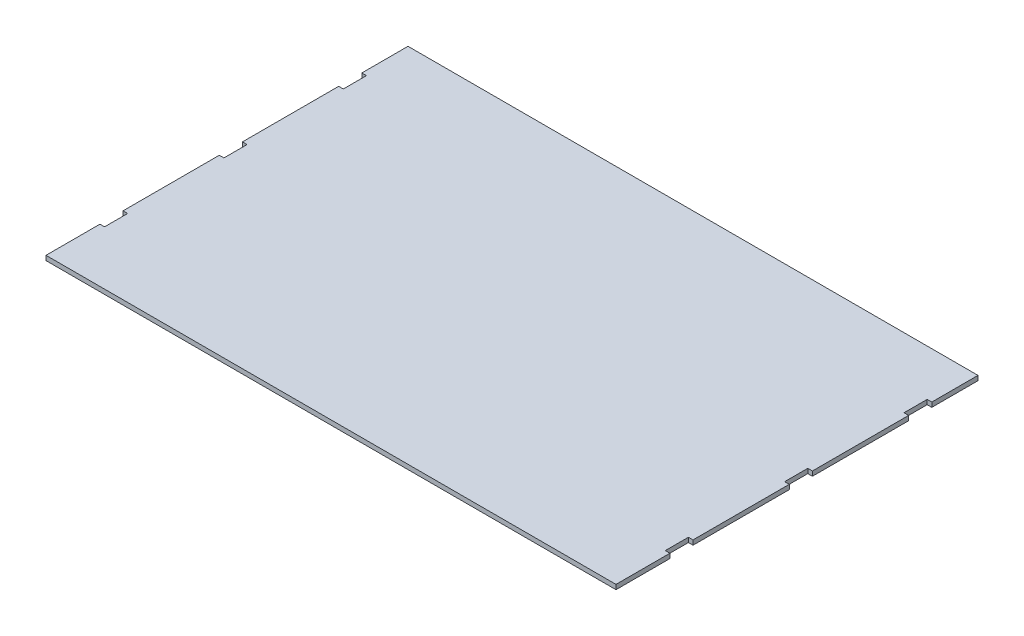
ISO-10303-21;
HEADER;
FILE_DESCRIPTION(('STEP AP214'),'2;1');
FILE_NAME('part.step','',(''),(''),'','','');
FILE_SCHEMA(('AUTOMOTIVE_DESIGN { 1 0 10303 214 1 1 1 1 }'));
ENDSEC;
DATA;
#1=APPLICATION_CONTEXT('core data for automotive mechanical design processes');
#2=APPLICATION_PROTOCOL_DEFINITION('international standard','automotive_design',2000,#1);
#3=PRODUCT_CONTEXT('',#1,'mechanical');
#4=PRODUCT('Part','Part','',(#3));
#5=PRODUCT_RELATED_PRODUCT_CATEGORY('part','',(#4));
#6=PRODUCT_DEFINITION_FORMATION('','',#4);
#7=PRODUCT_DEFINITION_CONTEXT('part definition',#1,'design');
#8=PRODUCT_DEFINITION('design','',#6,#7);
#9=PRODUCT_DEFINITION_SHAPE('','',#8);
#10=(LENGTH_UNIT() NAMED_UNIT(*) SI_UNIT(.MILLI.,.METRE.));
#11=(NAMED_UNIT(*) PLANE_ANGLE_UNIT() SI_UNIT($,.RADIAN.));
#12=(NAMED_UNIT(*) SI_UNIT($,.STERADIAN.) SOLID_ANGLE_UNIT());
#13=UNCERTAINTY_MEASURE_WITH_UNIT(LENGTH_MEASURE(1.E-05),#10,'distance_accuracy_value','');
#14=(GEOMETRIC_REPRESENTATION_CONTEXT(3) GLOBAL_UNCERTAINTY_ASSIGNED_CONTEXT((#13)) GLOBAL_UNIT_ASSIGNED_CONTEXT((#10,
#11,#12)) REPRESENTATION_CONTEXT('',''));
#15=CARTESIAN_POINT('',(0.,0.,0.));
#16=DIRECTION('',(0.,0.,1.));
#17=DIRECTION('',(1.,0.,0.));
#18=AXIS2_PLACEMENT_3D('',#15,#16,#17);
#19=CARTESIAN_POINT('',(0.,3.,0.));
#20=DIRECTION('',(1.,0.,0.));
#21=DIRECTION('',(0.,0.,-1.));
#22=AXIS2_PLACEMENT_3D('',#19,#20,#21);
#23=PLANE('',#22);
#24=DIRECTION('',(0.,0.,1.));
#25=VECTOR('',#24,1.);
#26=CARTESIAN_POINT('',(0.,0.,0.));
#27=LINE('',#26,#25);
#28=CARTESIAN_POINT('',(0.,0.,-35.0000000000001));
#29=VERTEX_POINT('',#28);
#30=CARTESIAN_POINT('',(0.,0.,0.));
#31=VERTEX_POINT('',#30);
#32=EDGE_CURVE('E250',#29,#31,#27,.T.);
#33=ORIENTED_EDGE('',*,*,#32,.T.);
#34=DIRECTION('',(0.,-1.,0.));
#35=VECTOR('',#34,1.);
#36=CARTESIAN_POINT('',(0.,3.,0.));
#37=LINE('',#36,#35);
#38=CARTESIAN_POINT('',(0.,3.,0.));
#39=VERTEX_POINT('',#38);
#40=EDGE_CURVE('E11',#39,#31,#37,.T.);
#41=ORIENTED_EDGE('',*,*,#40,.F.);
#42=DIRECTION('',(0.,0.,1.));
#43=VECTOR('',#42,1.);
#44=CARTESIAN_POINT('',(0.,3.,0.));
#45=LINE('',#44,#43);
#46=CARTESIAN_POINT('',(0.,3.,-35.0000000000001));
#47=VERTEX_POINT('',#46);
#48=EDGE_CURVE('E304',#47,#39,#45,.T.);
#49=ORIENTED_EDGE('',*,*,#48,.F.);
#50=DIRECTION('',(0.,-1.,0.));
#51=VECTOR('',#50,1.);
#52=CARTESIAN_POINT('',(0.,3.,-35.0000000000001));
#53=LINE('',#52,#51);
#54=EDGE_CURVE('E246',#47,#29,#53,.T.);
#55=ORIENTED_EDGE('',*,*,#54,.T.);
#56=EDGE_LOOP('',(#33,#41,#49,#55));
#57=FACE_BOUND('',#56,.T.);
#58=ADVANCED_FACE('F34',(#57),#23,.F.);
#59=CARTESIAN_POINT('',(0.,3.,0.));
#60=DIRECTION('',(0.,0.,-1.));
#61=DIRECTION('',(-1.,0.,0.));
#62=AXIS2_PLACEMENT_3D('',#59,#60,#61);
#63=PLANE('',#62);
#64=DIRECTION('',(1.,0.,0.));
#65=VECTOR('',#64,1.);
#66=CARTESIAN_POINT('',(0.,0.,0.));
#67=LINE('',#66,#65);
#68=CARTESIAN_POINT('',(370.,0.,0.));
#69=VERTEX_POINT('',#68);
#70=EDGE_CURVE('E253',#31,#69,#67,.T.);
#71=ORIENTED_EDGE('',*,*,#70,.T.);
#72=DIRECTION('',(0.,-1.,0.));
#73=VECTOR('',#72,1.);
#74=CARTESIAN_POINT('',(370.,3.,0.));
#75=LINE('',#74,#73);
#76=CARTESIAN_POINT('',(370.,3.,0.));
#77=VERTEX_POINT('',#76);
#78=EDGE_CURVE('E42',#77,#69,#75,.T.);
#79=ORIENTED_EDGE('',*,*,#78,.F.);
#80=DIRECTION('',(1.,0.,0.));
#81=VECTOR('',#80,1.);
#82=CARTESIAN_POINT('',(0.,3.,0.));
#83=LINE('',#82,#81);
#84=EDGE_CURVE('E153',#39,#77,#83,.T.);
#85=ORIENTED_EDGE('',*,*,#84,.F.);
#86=ORIENTED_EDGE('',*,*,#40,.T.);
#87=EDGE_LOOP('',(#71,#79,#85,#86));
#88=FACE_BOUND('',#87,.T.);
#89=ADVANCED_FACE('F462',(#88),#63,.F.);
#90=CARTESIAN_POINT('',(370.,3.,-35.));
#91=DIRECTION('',(-1.,0.,0.));
#92=DIRECTION('',(0.,0.,1.));
#93=AXIS2_PLACEMENT_3D('',#90,#91,#92);
#94=PLANE('',#93);
#95=DIRECTION('',(0.,0.,-1.));
#96=VECTOR('',#95,1.);
#97=CARTESIAN_POINT('',(370.,0.,-35.));
#98=LINE('',#97,#96);
#99=CARTESIAN_POINT('',(370.,0.,-35.));
#100=VERTEX_POINT('',#99);
#101=EDGE_CURVE('E255',#69,#100,#98,.T.);
#102=ORIENTED_EDGE('',*,*,#101,.T.);
#103=DIRECTION('',(0.,-1.,0.));
#104=VECTOR('',#103,1.);
#105=CARTESIAN_POINT('',(370.,3.,-35.));
#106=LINE('',#105,#104);
#107=CARTESIAN_POINT('',(370.,3.,-35.));
#108=VERTEX_POINT('',#107);
#109=EDGE_CURVE('E371',#108,#100,#106,.T.);
#110=ORIENTED_EDGE('',*,*,#109,.F.);
#111=DIRECTION('',(0.,0.,-1.));
#112=VECTOR('',#111,1.);
#113=CARTESIAN_POINT('',(370.,3.,-35.));
#114=LINE('',#113,#112);
#115=EDGE_CURVE('E379',#77,#108,#114,.T.);
#116=ORIENTED_EDGE('',*,*,#115,.F.);
#117=ORIENTED_EDGE('',*,*,#78,.T.);
#118=EDGE_LOOP('',(#102,#110,#116,#117));
#119=FACE_BOUND('',#118,.T.);
#120=ADVANCED_FACE('F377',(#119),#94,.F.);
#121=CARTESIAN_POINT('',(370.,3.,-35.));
#122=DIRECTION('',(0.,0.,1.));
#123=DIRECTION('',(1.,0.,0.));
#124=AXIS2_PLACEMENT_3D('',#121,#122,#123);
#125=PLANE('',#124);
#126=DIRECTION('',(-1.,0.,0.));
#127=VECTOR('',#126,1.);
#128=CARTESIAN_POINT('',(370.,0.,-35.));
#129=LINE('',#128,#127);
#130=CARTESIAN_POINT('',(367.,0.,-35.));
#131=VERTEX_POINT('',#130);
#132=EDGE_CURVE('E257',#100,#131,#129,.T.);
#133=ORIENTED_EDGE('',*,*,#132,.T.);
#134=DIRECTION('',(0.,-1.,0.));
#135=VECTOR('',#134,1.);
#136=CARTESIAN_POINT('',(367.,3.,-35.));
#137=LINE('',#136,#135);
#138=CARTESIAN_POINT('',(367.,3.,-35.));
#139=VERTEX_POINT('',#138);
#140=EDGE_CURVE('E368',#139,#131,#137,.T.);
#141=ORIENTED_EDGE('',*,*,#140,.F.);
#142=DIRECTION('',(-1.,0.,0.));
#143=VECTOR('',#142,1.);
#144=CARTESIAN_POINT('',(370.,3.,-35.));
#145=LINE('',#144,#143);
#146=EDGE_CURVE('E397',#108,#139,#145,.T.);
#147=ORIENTED_EDGE('',*,*,#146,.F.);
#148=ORIENTED_EDGE('',*,*,#109,.T.);
#149=EDGE_LOOP('',(#133,#141,#147,#148));
#150=FACE_BOUND('',#149,.T.);
#151=ADVANCED_FACE('F388',(#150),#125,.F.);
#152=CARTESIAN_POINT('',(367.,3.,-35.));
#153=DIRECTION('',(-1.,0.,0.));
#154=DIRECTION('',(0.,0.,1.));
#155=AXIS2_PLACEMENT_3D('',#152,#153,#154);
#156=PLANE('',#155);
#157=DIRECTION('',(0.,0.,-1.));
#158=VECTOR('',#157,1.);
#159=CARTESIAN_POINT('',(367.,0.,-35.));
#160=LINE('',#159,#158);
#161=CARTESIAN_POINT('',(367.,0.,-49.9999999999999));
#162=VERTEX_POINT('',#161);
#163=EDGE_CURVE('E259',#131,#162,#160,.T.);
#164=ORIENTED_EDGE('',*,*,#163,.T.);
#165=DIRECTION('',(0.,-1.,0.));
#166=VECTOR('',#165,1.);
#167=CARTESIAN_POINT('',(367.,3.,-49.9999999999999));
#168=LINE('',#167,#166);
#169=CARTESIAN_POINT('',(367.,3.,-49.9999999999999));
#170=VERTEX_POINT('',#169);
#171=EDGE_CURVE('E365',#170,#162,#168,.T.);
#172=ORIENTED_EDGE('',*,*,#171,.F.);
#173=DIRECTION('',(0.,0.,-1.));
#174=VECTOR('',#173,1.);
#175=CARTESIAN_POINT('',(367.,3.,-35.));
#176=LINE('',#175,#174);
#177=EDGE_CURVE('E394',#139,#170,#176,.T.);
#178=ORIENTED_EDGE('',*,*,#177,.F.);
#179=ORIENTED_EDGE('',*,*,#140,.T.);
#180=EDGE_LOOP('',(#164,#172,#178,#179));
#181=FACE_BOUND('',#180,.T.);
#182=ADVANCED_FACE('F392',(#181),#156,.F.);
#183=CARTESIAN_POINT('',(367.,3.,-49.9999999999999));
#184=DIRECTION('',(0.,0.,-1.));
#185=DIRECTION('',(-1.,0.,0.));
#186=AXIS2_PLACEMENT_3D('',#183,#184,#185);
#187=PLANE('',#186);
#188=DIRECTION('',(1.,0.,0.));
#189=VECTOR('',#188,1.);
#190=CARTESIAN_POINT('',(367.,0.,-49.9999999999999));
#191=LINE('',#190,#189);
#192=CARTESIAN_POINT('',(370.,0.,-49.9999999999999));
#193=VERTEX_POINT('',#192);
#194=EDGE_CURVE('E261',#162,#193,#191,.T.);
#195=ORIENTED_EDGE('',*,*,#194,.T.);
#196=DIRECTION('',(0.,-1.,0.));
#197=VECTOR('',#196,1.);
#198=CARTESIAN_POINT('',(370.,3.,-49.9999999999999));
#199=LINE('',#198,#197);
#200=CARTESIAN_POINT('',(370.,3.,-49.9999999999999));
#201=VERTEX_POINT('',#200);
#202=EDGE_CURVE('E362',#201,#193,#199,.T.);
#203=ORIENTED_EDGE('',*,*,#202,.F.);
#204=DIRECTION('',(1.,0.,0.));
#205=VECTOR('',#204,1.);
#206=CARTESIAN_POINT('',(367.,3.,-49.9999999999999));
#207=LINE('',#206,#205);
#208=EDGE_CURVE('E396',#170,#201,#207,.T.);
#209=ORIENTED_EDGE('',*,*,#208,.F.);
#210=ORIENTED_EDGE('',*,*,#171,.T.);
#211=EDGE_LOOP('',(#195,#203,#209,#210));
#212=FACE_BOUND('',#211,.T.);
#213=ADVANCED_FACE('F475',(#212),#187,.F.);
#214=CARTESIAN_POINT('',(370.,3.,-112.5));
#215=DIRECTION('',(-1.,0.,0.));
#216=DIRECTION('',(0.,0.,1.));
#217=AXIS2_PLACEMENT_3D('',#214,#215,#216);
#218=PLANE('',#217);
#219=DIRECTION('',(0.,0.,-1.));
#220=VECTOR('',#219,1.);
#221=CARTESIAN_POINT('',(370.,0.,-112.5));
#222=LINE('',#221,#220);
#223=CARTESIAN_POINT('',(370.,0.,-112.5));
#224=VERTEX_POINT('',#223);
#225=EDGE_CURVE('E263',#193,#224,#222,.T.);
#226=ORIENTED_EDGE('',*,*,#225,.T.);
#227=DIRECTION('',(0.,-1.,0.));
#228=VECTOR('',#227,1.);
#229=CARTESIAN_POINT('',(370.,3.,-112.5));
#230=LINE('',#229,#228);
#231=CARTESIAN_POINT('',(370.,3.,-112.5));
#232=VERTEX_POINT('',#231);
#233=EDGE_CURVE('E359',#232,#224,#230,.T.);
#234=ORIENTED_EDGE('',*,*,#233,.F.);
#235=DIRECTION('',(0.,0.,-1.));
#236=VECTOR('',#235,1.);
#237=CARTESIAN_POINT('',(370.,3.,-112.5));
#238=LINE('',#237,#236);
#239=EDGE_CURVE('E399',#201,#232,#238,.T.);
#240=ORIENTED_EDGE('',*,*,#239,.F.);
#241=ORIENTED_EDGE('',*,*,#202,.T.);
#242=EDGE_LOOP('',(#226,#234,#240,#241));
#243=FACE_BOUND('',#242,.T.);
#244=ADVANCED_FACE('F478',(#243),#218,.F.);
#245=CARTESIAN_POINT('',(367.,3.,-112.5));
#246=DIRECTION('',(0.,0.,1.));
#247=DIRECTION('',(1.,0.,0.));
#248=AXIS2_PLACEMENT_3D('',#245,#246,#247);
#249=PLANE('',#248);
#250=DIRECTION('',(-1.,0.,0.));
#251=VECTOR('',#250,1.);
#252=CARTESIAN_POINT('',(367.,0.,-112.5));
#253=LINE('',#252,#251);
#254=CARTESIAN_POINT('',(367.,0.,-112.5));
#255=VERTEX_POINT('',#254);
#256=EDGE_CURVE('E265',#224,#255,#253,.T.);
#257=ORIENTED_EDGE('',*,*,#256,.T.);
#258=DIRECTION('',(0.,-1.,0.));
#259=VECTOR('',#258,1.);
#260=CARTESIAN_POINT('',(367.,3.,-112.5));
#261=LINE('',#260,#259);
#262=CARTESIAN_POINT('',(367.,3.,-112.5));
#263=VERTEX_POINT('',#262);
#264=EDGE_CURVE('E356',#263,#255,#261,.T.);
#265=ORIENTED_EDGE('',*,*,#264,.F.);
#266=DIRECTION('',(-1.,0.,0.));
#267=VECTOR('',#266,1.);
#268=CARTESIAN_POINT('',(367.,3.,-112.5));
#269=LINE('',#268,#267);
#270=EDGE_CURVE('E405',#232,#263,#269,.T.);
#271=ORIENTED_EDGE('',*,*,#270,.F.);
#272=ORIENTED_EDGE('',*,*,#233,.T.);
#273=EDGE_LOOP('',(#257,#265,#271,#272));
#274=FACE_BOUND('',#273,.T.);
#275=ADVANCED_FACE('F482',(#274),#249,.F.);
#276=CARTESIAN_POINT('',(367.,3.,-127.5));
#277=DIRECTION('',(-1.,0.,0.));
#278=DIRECTION('',(0.,0.,1.));
#279=AXIS2_PLACEMENT_3D('',#276,#277,#278);
#280=PLANE('',#279);
#281=DIRECTION('',(0.,0.,-1.));
#282=VECTOR('',#281,1.);
#283=CARTESIAN_POINT('',(367.,0.,-127.5));
#284=LINE('',#283,#282);
#285=CARTESIAN_POINT('',(367.,0.,-127.5));
#286=VERTEX_POINT('',#285);
#287=EDGE_CURVE('E267',#255,#286,#284,.T.);
#288=ORIENTED_EDGE('',*,*,#287,.T.);
#289=DIRECTION('',(0.,-1.,0.));
#290=VECTOR('',#289,1.);
#291=CARTESIAN_POINT('',(367.,3.,-127.5));
#292=LINE('',#291,#290);
#293=CARTESIAN_POINT('',(367.,3.,-127.5));
#294=VERTEX_POINT('',#293);
#295=EDGE_CURVE('E353',#294,#286,#292,.T.);
#296=ORIENTED_EDGE('',*,*,#295,.F.);
#297=DIRECTION('',(0.,0.,-1.));
#298=VECTOR('',#297,1.);
#299=CARTESIAN_POINT('',(367.,3.,-127.5));
#300=LINE('',#299,#298);
#301=EDGE_CURVE('E407',#263,#294,#300,.T.);
#302=ORIENTED_EDGE('',*,*,#301,.F.);
#303=ORIENTED_EDGE('',*,*,#264,.T.);
#304=EDGE_LOOP('',(#288,#296,#302,#303));
#305=FACE_BOUND('',#304,.T.);
#306=ADVANCED_FACE('F486',(#305),#280,.F.);
#307=CARTESIAN_POINT('',(370.,3.,-127.5));
#308=DIRECTION('',(0.,0.,-1.));
#309=DIRECTION('',(-1.,0.,0.));
#310=AXIS2_PLACEMENT_3D('',#307,#308,#309);
#311=PLANE('',#310);
#312=DIRECTION('',(1.,0.,0.));
#313=VECTOR('',#312,1.);
#314=CARTESIAN_POINT('',(370.,0.,-127.5));
#315=LINE('',#314,#313);
#316=CARTESIAN_POINT('',(370.,0.,-127.5));
#317=VERTEX_POINT('',#316);
#318=EDGE_CURVE('E269',#286,#317,#315,.T.);
#319=ORIENTED_EDGE('',*,*,#318,.T.);
#320=DIRECTION('',(0.,-1.,0.));
#321=VECTOR('',#320,1.);
#322=CARTESIAN_POINT('',(370.,3.,-127.5));
#323=LINE('',#322,#321);
#324=CARTESIAN_POINT('',(370.,3.,-127.5));
#325=VERTEX_POINT('',#324);
#326=EDGE_CURVE('E350',#325,#317,#323,.T.);
#327=ORIENTED_EDGE('',*,*,#326,.F.);
#328=DIRECTION('',(1.,0.,0.));
#329=VECTOR('',#328,1.);
#330=CARTESIAN_POINT('',(370.,3.,-127.5));
#331=LINE('',#330,#329);
#332=EDGE_CURVE('E409',#294,#325,#331,.T.);
#333=ORIENTED_EDGE('',*,*,#332,.F.);
#334=ORIENTED_EDGE('',*,*,#295,.T.);
#335=EDGE_LOOP('',(#319,#327,#333,#334));
#336=FACE_BOUND('',#335,.T.);
#337=ADVANCED_FACE('F490',(#336),#311,.F.);
#338=CARTESIAN_POINT('',(370.,3.,-190.));
#339=DIRECTION('',(-1.,0.,0.));
#340=DIRECTION('',(0.,0.,1.));
#341=AXIS2_PLACEMENT_3D('',#338,#339,#340);
#342=PLANE('',#341);
#343=DIRECTION('',(0.,0.,-1.));
#344=VECTOR('',#343,1.);
#345=CARTESIAN_POINT('',(370.,0.,-190.));
#346=LINE('',#345,#344);
#347=CARTESIAN_POINT('',(370.,0.,-190.));
#348=VERTEX_POINT('',#347);
#349=EDGE_CURVE('E271',#317,#348,#346,.T.);
#350=ORIENTED_EDGE('',*,*,#349,.T.);
#351=DIRECTION('',(0.,-1.,0.));
#352=VECTOR('',#351,1.);
#353=CARTESIAN_POINT('',(370.,3.,-190.));
#354=LINE('',#353,#352);
#355=CARTESIAN_POINT('',(370.,3.,-190.));
#356=VERTEX_POINT('',#355);
#357=EDGE_CURVE('E347',#356,#348,#354,.T.);
#358=ORIENTED_EDGE('',*,*,#357,.F.);
#359=DIRECTION('',(0.,0.,-1.));
#360=VECTOR('',#359,1.);
#361=CARTESIAN_POINT('',(370.,3.,-190.));
#362=LINE('',#361,#360);
#363=EDGE_CURVE('E411',#325,#356,#362,.T.);
#364=ORIENTED_EDGE('',*,*,#363,.F.);
#365=ORIENTED_EDGE('',*,*,#326,.T.);
#366=EDGE_LOOP('',(#350,#358,#364,#365));
#367=FACE_BOUND('',#366,.T.);
#368=ADVANCED_FACE('F494',(#367),#342,.F.);
#369=CARTESIAN_POINT('',(367.,3.,-190.));
#370=DIRECTION('',(0.,0.,1.));
#371=DIRECTION('',(1.,0.,0.));
#372=AXIS2_PLACEMENT_3D('',#369,#370,#371);
#373=PLANE('',#372);
#374=DIRECTION('',(-1.,0.,0.));
#375=VECTOR('',#374,1.);
#376=CARTESIAN_POINT('',(367.,0.,-190.));
#377=LINE('',#376,#375);
#378=CARTESIAN_POINT('',(367.,0.,-190.));
#379=VERTEX_POINT('',#378);
#380=EDGE_CURVE('E273',#348,#379,#377,.T.);
#381=ORIENTED_EDGE('',*,*,#380,.T.);
#382=DIRECTION('',(0.,-1.,0.));
#383=VECTOR('',#382,1.);
#384=CARTESIAN_POINT('',(367.,3.,-190.));
#385=LINE('',#384,#383);
#386=CARTESIAN_POINT('',(367.,3.,-190.));
#387=VERTEX_POINT('',#386);
#388=EDGE_CURVE('E344',#387,#379,#385,.T.);
#389=ORIENTED_EDGE('',*,*,#388,.F.);
#390=DIRECTION('',(-1.,0.,0.));
#391=VECTOR('',#390,1.);
#392=CARTESIAN_POINT('',(367.,3.,-190.));
#393=LINE('',#392,#391);
#394=EDGE_CURVE('E413',#356,#387,#393,.T.);
#395=ORIENTED_EDGE('',*,*,#394,.F.);
#396=ORIENTED_EDGE('',*,*,#357,.T.);
#397=EDGE_LOOP('',(#381,#389,#395,#396));
#398=FACE_BOUND('',#397,.T.);
#399=ADVANCED_FACE('F498',(#398),#373,.F.);
#400=CARTESIAN_POINT('',(367.,3.,-205.));
#401=DIRECTION('',(-1.,0.,0.));
#402=DIRECTION('',(0.,0.,1.));
#403=AXIS2_PLACEMENT_3D('',#400,#401,#402);
#404=PLANE('',#403);
#405=DIRECTION('',(0.,0.,-1.));
#406=VECTOR('',#405,1.);
#407=CARTESIAN_POINT('',(367.,0.,-205.));
#408=LINE('',#407,#406);
#409=CARTESIAN_POINT('',(367.,0.,-205.));
#410=VERTEX_POINT('',#409);
#411=EDGE_CURVE('E275',#379,#410,#408,.T.);
#412=ORIENTED_EDGE('',*,*,#411,.T.);
#413=DIRECTION('',(0.,-1.,0.));
#414=VECTOR('',#413,1.);
#415=CARTESIAN_POINT('',(367.,3.,-205.));
#416=LINE('',#415,#414);
#417=CARTESIAN_POINT('',(367.,3.,-205.));
#418=VERTEX_POINT('',#417);
#419=EDGE_CURVE('E341',#418,#410,#416,.T.);
#420=ORIENTED_EDGE('',*,*,#419,.F.);
#421=DIRECTION('',(0.,0.,-1.));
#422=VECTOR('',#421,1.);
#423=CARTESIAN_POINT('',(367.,3.,-205.));
#424=LINE('',#423,#422);
#425=EDGE_CURVE('E415',#387,#418,#424,.T.);
#426=ORIENTED_EDGE('',*,*,#425,.F.);
#427=ORIENTED_EDGE('',*,*,#388,.T.);
#428=EDGE_LOOP('',(#412,#420,#426,#427));
#429=FACE_BOUND('',#428,.T.);
#430=ADVANCED_FACE('F502',(#429),#404,.F.);
#431=CARTESIAN_POINT('',(370.,3.,-205.));
#432=DIRECTION('',(0.,0.,-1.));
#433=DIRECTION('',(-1.,0.,0.));
#434=AXIS2_PLACEMENT_3D('',#431,#432,#433);
#435=PLANE('',#434);
#436=DIRECTION('',(1.,0.,0.));
#437=VECTOR('',#436,1.);
#438=CARTESIAN_POINT('',(370.,0.,-205.));
#439=LINE('',#438,#437);
#440=CARTESIAN_POINT('',(370.,0.,-205.));
#441=VERTEX_POINT('',#440);
#442=EDGE_CURVE('E277',#410,#441,#439,.T.);
#443=ORIENTED_EDGE('',*,*,#442,.T.);
#444=DIRECTION('',(0.,-1.,0.));
#445=VECTOR('',#444,1.);
#446=CARTESIAN_POINT('',(370.,3.,-205.));
#447=LINE('',#446,#445);
#448=CARTESIAN_POINT('',(370.,3.,-205.));
#449=VERTEX_POINT('',#448);
#450=EDGE_CURVE('E338',#449,#441,#447,.T.);
#451=ORIENTED_EDGE('',*,*,#450,.F.);
#452=DIRECTION('',(1.,0.,0.));
#453=VECTOR('',#452,1.);
#454=CARTESIAN_POINT('',(370.,3.,-205.));
#455=LINE('',#454,#453);
#456=EDGE_CURVE('E417',#418,#449,#455,.T.);
#457=ORIENTED_EDGE('',*,*,#456,.F.);
#458=ORIENTED_EDGE('',*,*,#419,.T.);
#459=EDGE_LOOP('',(#443,#451,#457,#458));
#460=FACE_BOUND('',#459,.T.);
#461=ADVANCED_FACE('F506',(#460),#435,.F.);
#462=CARTESIAN_POINT('',(370.,3.,-235.));
#463=DIRECTION('',(-1.,0.,0.));
#464=DIRECTION('',(0.,0.,1.));
#465=AXIS2_PLACEMENT_3D('',#462,#463,#464);
#466=PLANE('',#465);
#467=DIRECTION('',(0.,0.,-1.));
#468=VECTOR('',#467,1.);
#469=CARTESIAN_POINT('',(370.,0.,-235.));
#470=LINE('',#469,#468);
#471=CARTESIAN_POINT('',(370.,0.,-235.));
#472=VERTEX_POINT('',#471);
#473=EDGE_CURVE('E279',#441,#472,#470,.T.);
#474=ORIENTED_EDGE('',*,*,#473,.T.);
#475=DIRECTION('',(0.,-1.,0.));
#476=VECTOR('',#475,1.);
#477=CARTESIAN_POINT('',(370.,3.,-235.));
#478=LINE('',#477,#476);
#479=CARTESIAN_POINT('',(370.,3.,-235.));
#480=VERTEX_POINT('',#479);
#481=EDGE_CURVE('E335',#480,#472,#478,.T.);
#482=ORIENTED_EDGE('',*,*,#481,.F.);
#483=DIRECTION('',(0.,0.,-1.));
#484=VECTOR('',#483,1.);
#485=CARTESIAN_POINT('',(370.,3.,-235.));
#486=LINE('',#485,#484);
#487=EDGE_CURVE('E419',#449,#480,#486,.T.);
#488=ORIENTED_EDGE('',*,*,#487,.F.);
#489=ORIENTED_EDGE('',*,*,#450,.T.);
#490=EDGE_LOOP('',(#474,#482,#488,#489));
#491=FACE_BOUND('',#490,.T.);
#492=ADVANCED_FACE('F510',(#491),#466,.F.);
#493=CARTESIAN_POINT('',(0.,3.,-235.));
#494=DIRECTION('',(0.,0.,1.));
#495=DIRECTION('',(1.,0.,0.));
#496=AXIS2_PLACEMENT_3D('',#493,#494,#495);
#497=PLANE('',#496);
#498=DIRECTION('',(-1.,0.,0.));
#499=VECTOR('',#498,1.);
#500=CARTESIAN_POINT('',(0.,0.,-235.));
#501=LINE('',#500,#499);
#502=CARTESIAN_POINT('',(0.,0.,-235.));
#503=VERTEX_POINT('',#502);
#504=EDGE_CURVE('E281',#472,#503,#501,.T.);
#505=ORIENTED_EDGE('',*,*,#504,.T.);
#506=DIRECTION('',(0.,-1.,0.));
#507=VECTOR('',#506,1.);
#508=CARTESIAN_POINT('',(0.,3.,-235.));
#509=LINE('',#508,#507);
#510=CARTESIAN_POINT('',(0.,3.,-235.));
#511=VERTEX_POINT('',#510);
#512=EDGE_CURVE('E332',#511,#503,#509,.T.);
#513=ORIENTED_EDGE('',*,*,#512,.F.);
#514=DIRECTION('',(-1.,0.,0.));
#515=VECTOR('',#514,1.);
#516=CARTESIAN_POINT('',(0.,3.,-235.));
#517=LINE('',#516,#515);
#518=EDGE_CURVE('E421',#480,#511,#517,.T.);
#519=ORIENTED_EDGE('',*,*,#518,.F.);
#520=ORIENTED_EDGE('',*,*,#481,.T.);
#521=EDGE_LOOP('',(#505,#513,#519,#520));
#522=FACE_BOUND('',#521,.T.);
#523=ADVANCED_FACE('F514',(#522),#497,.F.);
#524=CARTESIAN_POINT('',(0.,3.,-205.));
#525=DIRECTION('',(1.,0.,0.));
#526=DIRECTION('',(0.,0.,-1.));
#527=AXIS2_PLACEMENT_3D('',#524,#525,#526);
#528=PLANE('',#527);
#529=DIRECTION('',(0.,0.,1.));
#530=VECTOR('',#529,1.);
#531=CARTESIAN_POINT('',(0.,0.,-205.));
#532=LINE('',#531,#530);
#533=CARTESIAN_POINT('',(0.,0.,-205.));
#534=VERTEX_POINT('',#533);
#535=EDGE_CURVE('E283',#503,#534,#532,.T.);
#536=ORIENTED_EDGE('',*,*,#535,.T.);
#537=DIRECTION('',(0.,-1.,0.));
#538=VECTOR('',#537,1.);
#539=CARTESIAN_POINT('',(0.,3.,-205.));
#540=LINE('',#539,#538);
#541=CARTESIAN_POINT('',(0.,3.,-205.));
#542=VERTEX_POINT('',#541);
#543=EDGE_CURVE('E329',#542,#534,#540,.T.);
#544=ORIENTED_EDGE('',*,*,#543,.F.);
#545=DIRECTION('',(0.,0.,1.));
#546=VECTOR('',#545,1.);
#547=CARTESIAN_POINT('',(0.,3.,-205.));
#548=LINE('',#547,#546);
#549=EDGE_CURVE('E423',#511,#542,#548,.T.);
#550=ORIENTED_EDGE('',*,*,#549,.F.);
#551=ORIENTED_EDGE('',*,*,#512,.T.);
#552=EDGE_LOOP('',(#536,#544,#550,#551));
#553=FACE_BOUND('',#552,.T.);
#554=ADVANCED_FACE('F518',(#553),#528,.F.);
#555=CARTESIAN_POINT('',(0.,3.,-205.));
#556=DIRECTION('',(0.,0.,-1.));
#557=DIRECTION('',(-1.,0.,0.));
#558=AXIS2_PLACEMENT_3D('',#555,#556,#557);
#559=PLANE('',#558);
#560=DIRECTION('',(1.,0.,0.));
#561=VECTOR('',#560,1.);
#562=CARTESIAN_POINT('',(0.,0.,-205.));
#563=LINE('',#562,#561);
#564=CARTESIAN_POINT('',(3.,0.,-205.));
#565=VERTEX_POINT('',#564);
#566=EDGE_CURVE('E285',#534,#565,#563,.T.);
#567=ORIENTED_EDGE('',*,*,#566,.T.);
#568=DIRECTION('',(0.,-1.,0.));
#569=VECTOR('',#568,1.);
#570=CARTESIAN_POINT('',(3.,3.,-205.));
#571=LINE('',#570,#569);
#572=CARTESIAN_POINT('',(3.,3.,-205.));
#573=VERTEX_POINT('',#572);
#574=EDGE_CURVE('E326',#573,#565,#571,.T.);
#575=ORIENTED_EDGE('',*,*,#574,.F.);
#576=DIRECTION('',(1.,0.,0.));
#577=VECTOR('',#576,1.);
#578=CARTESIAN_POINT('',(0.,3.,-205.));
#579=LINE('',#578,#577);
#580=EDGE_CURVE('E425',#542,#573,#579,.T.);
#581=ORIENTED_EDGE('',*,*,#580,.F.);
#582=ORIENTED_EDGE('',*,*,#543,.T.);
#583=EDGE_LOOP('',(#567,#575,#581,#582));
#584=FACE_BOUND('',#583,.T.);
#585=ADVANCED_FACE('F522',(#584),#559,.F.);
#586=CARTESIAN_POINT('',(3.,3.,-205.));
#587=DIRECTION('',(1.,0.,0.));
#588=DIRECTION('',(0.,0.,-1.));
#589=AXIS2_PLACEMENT_3D('',#586,#587,#588);
#590=PLANE('',#589);
#591=DIRECTION('',(0.,0.,1.));
#592=VECTOR('',#591,1.);
#593=CARTESIAN_POINT('',(3.,0.,-205.));
#594=LINE('',#593,#592);
#595=CARTESIAN_POINT('',(2.99999999999995,0.,-190.));
#596=VERTEX_POINT('',#595);
#597=EDGE_CURVE('E287',#565,#596,#594,.T.);
#598=ORIENTED_EDGE('',*,*,#597,.T.);
#599=DIRECTION('',(0.,-1.,0.));
#600=VECTOR('',#599,1.);
#601=CARTESIAN_POINT('',(2.99999999999995,3.,-190.));
#602=LINE('',#601,#600);
#603=CARTESIAN_POINT('',(2.99999999999995,3.,-190.));
#604=VERTEX_POINT('',#603);
#605=EDGE_CURVE('E323',#604,#596,#602,.T.);
#606=ORIENTED_EDGE('',*,*,#605,.F.);
#607=DIRECTION('',(0.,0.,1.));
#608=VECTOR('',#607,1.);
#609=CARTESIAN_POINT('',(3.,3.,-205.));
#610=LINE('',#609,#608);
#611=EDGE_CURVE('E427',#573,#604,#610,.T.);
#612=ORIENTED_EDGE('',*,*,#611,.F.);
#613=ORIENTED_EDGE('',*,*,#574,.T.);
#614=EDGE_LOOP('',(#598,#606,#612,#613));
#615=FACE_BOUND('',#614,.T.);
#616=ADVANCED_FACE('F526',(#615),#590,.F.);
#617=CARTESIAN_POINT('',(2.99999999999995,3.,-190.));
#618=DIRECTION('',(0.,0.,1.));
#619=DIRECTION('',(1.,0.,0.));
#620=AXIS2_PLACEMENT_3D('',#617,#618,#619);
#621=PLANE('',#620);
#622=DIRECTION('',(-1.,0.,0.));
#623=VECTOR('',#622,1.);
#624=CARTESIAN_POINT('',(2.99999999999995,0.,-190.));
#625=LINE('',#624,#623);
#626=CARTESIAN_POINT('',(0.,0.,-190.));
#627=VERTEX_POINT('',#626);
#628=EDGE_CURVE('E289',#596,#627,#625,.T.);
#629=ORIENTED_EDGE('',*,*,#628,.T.);
#630=DIRECTION('',(0.,-1.,0.));
#631=VECTOR('',#630,1.);
#632=CARTESIAN_POINT('',(0.,3.,-190.));
#633=LINE('',#632,#631);
#634=CARTESIAN_POINT('',(0.,3.,-190.));
#635=VERTEX_POINT('',#634);
#636=EDGE_CURVE('E320',#635,#627,#633,.T.);
#637=ORIENTED_EDGE('',*,*,#636,.F.);
#638=DIRECTION('',(-1.,0.,0.));
#639=VECTOR('',#638,1.);
#640=CARTESIAN_POINT('',(2.99999999999995,3.,-190.));
#641=LINE('',#640,#639);
#642=EDGE_CURVE('E429',#604,#635,#641,.T.);
#643=ORIENTED_EDGE('',*,*,#642,.F.);
#644=ORIENTED_EDGE('',*,*,#605,.T.);
#645=EDGE_LOOP('',(#629,#637,#643,#644));
#646=FACE_BOUND('',#645,.T.);
#647=ADVANCED_FACE('F530',(#646),#621,.F.);
#648=CARTESIAN_POINT('',(0.,3.,-127.5));
#649=DIRECTION('',(1.,0.,0.));
#650=DIRECTION('',(0.,0.,-1.));
#651=AXIS2_PLACEMENT_3D('',#648,#649,#650);
#652=PLANE('',#651);
#653=DIRECTION('',(0.,0.,1.));
#654=VECTOR('',#653,1.);
#655=CARTESIAN_POINT('',(0.,0.,-127.5));
#656=LINE('',#655,#654);
#657=CARTESIAN_POINT('',(0.,0.,-127.5));
#658=VERTEX_POINT('',#657);
#659=EDGE_CURVE('E291',#627,#658,#656,.T.);
#660=ORIENTED_EDGE('',*,*,#659,.T.);
#661=DIRECTION('',(0.,-1.,0.));
#662=VECTOR('',#661,1.);
#663=CARTESIAN_POINT('',(0.,3.,-127.5));
#664=LINE('',#663,#662);
#665=CARTESIAN_POINT('',(0.,3.,-127.5));
#666=VERTEX_POINT('',#665);
#667=EDGE_CURVE('E317',#666,#658,#664,.T.);
#668=ORIENTED_EDGE('',*,*,#667,.F.);
#669=DIRECTION('',(0.,0.,1.));
#670=VECTOR('',#669,1.);
#671=CARTESIAN_POINT('',(0.,3.,-127.5));
#672=LINE('',#671,#670);
#673=EDGE_CURVE('E431',#635,#666,#672,.T.);
#674=ORIENTED_EDGE('',*,*,#673,.F.);
#675=ORIENTED_EDGE('',*,*,#636,.T.);
#676=EDGE_LOOP('',(#660,#668,#674,#675));
#677=FACE_BOUND('',#676,.T.);
#678=ADVANCED_FACE('F534',(#677),#652,.F.);
#679=CARTESIAN_POINT('',(0.,3.,-127.5));
#680=DIRECTION('',(0.,0.,-1.));
#681=DIRECTION('',(-1.,0.,0.));
#682=AXIS2_PLACEMENT_3D('',#679,#680,#681);
#683=PLANE('',#682);
#684=DIRECTION('',(1.,0.,0.));
#685=VECTOR('',#684,1.);
#686=CARTESIAN_POINT('',(0.,0.,-127.5));
#687=LINE('',#686,#685);
#688=CARTESIAN_POINT('',(3.,0.,-127.5));
#689=VERTEX_POINT('',#688);
#690=EDGE_CURVE('E293',#658,#689,#687,.T.);
#691=ORIENTED_EDGE('',*,*,#690,.T.);
#692=DIRECTION('',(0.,-1.,0.));
#693=VECTOR('',#692,1.);
#694=CARTESIAN_POINT('',(3.,3.,-127.5));
#695=LINE('',#694,#693);
#696=CARTESIAN_POINT('',(3.,3.,-127.5));
#697=VERTEX_POINT('',#696);
#698=EDGE_CURVE('E314',#697,#689,#695,.T.);
#699=ORIENTED_EDGE('',*,*,#698,.F.);
#700=DIRECTION('',(1.,0.,0.));
#701=VECTOR('',#700,1.);
#702=CARTESIAN_POINT('',(0.,3.,-127.5));
#703=LINE('',#702,#701);
#704=EDGE_CURVE('E433',#666,#697,#703,.T.);
#705=ORIENTED_EDGE('',*,*,#704,.F.);
#706=ORIENTED_EDGE('',*,*,#667,.T.);
#707=EDGE_LOOP('',(#691,#699,#705,#706));
#708=FACE_BOUND('',#707,.T.);
#709=ADVANCED_FACE('F538',(#708),#683,.F.);
#710=CARTESIAN_POINT('',(3.,3.,-127.5));
#711=DIRECTION('',(1.,0.,0.));
#712=DIRECTION('',(0.,0.,-1.));
#713=AXIS2_PLACEMENT_3D('',#710,#711,#712);
#714=PLANE('',#713);
#715=DIRECTION('',(0.,0.,1.));
#716=VECTOR('',#715,1.);
#717=CARTESIAN_POINT('',(3.,0.,-127.5));
#718=LINE('',#717,#716);
#719=CARTESIAN_POINT('',(3.,0.,-112.5));
#720=VERTEX_POINT('',#719);
#721=EDGE_CURVE('E295',#689,#720,#718,.T.);
#722=ORIENTED_EDGE('',*,*,#721,.T.);
#723=DIRECTION('',(0.,-1.,0.));
#724=VECTOR('',#723,1.);
#725=CARTESIAN_POINT('',(3.,3.,-112.5));
#726=LINE('',#725,#724);
#727=CARTESIAN_POINT('',(3.,3.,-112.5));
#728=VERTEX_POINT('',#727);
#729=EDGE_CURVE('E311',#728,#720,#726,.T.);
#730=ORIENTED_EDGE('',*,*,#729,.F.);
#731=DIRECTION('',(0.,0.,1.));
#732=VECTOR('',#731,1.);
#733=CARTESIAN_POINT('',(3.,3.,-127.5));
#734=LINE('',#733,#732);
#735=EDGE_CURVE('E435',#697,#728,#734,.T.);
#736=ORIENTED_EDGE('',*,*,#735,.F.);
#737=ORIENTED_EDGE('',*,*,#698,.T.);
#738=EDGE_LOOP('',(#722,#730,#736,#737));
#739=FACE_BOUND('',#738,.T.);
#740=ADVANCED_FACE('F542',(#739),#714,.F.);
#741=CARTESIAN_POINT('',(3.,3.,-112.5));
#742=DIRECTION('',(0.,0.,1.));
#743=DIRECTION('',(1.,0.,0.));
#744=AXIS2_PLACEMENT_3D('',#741,#742,#743);
#745=PLANE('',#744);
#746=DIRECTION('',(-1.,0.,0.));
#747=VECTOR('',#746,1.);
#748=CARTESIAN_POINT('',(3.,0.,-112.5));
#749=LINE('',#748,#747);
#750=CARTESIAN_POINT('',(0.,0.,-112.5));
#751=VERTEX_POINT('',#750);
#752=EDGE_CURVE('E297',#720,#751,#749,.T.);
#753=ORIENTED_EDGE('',*,*,#752,.T.);
#754=DIRECTION('',(0.,-1.,0.));
#755=VECTOR('',#754,1.);
#756=CARTESIAN_POINT('',(0.,3.,-112.5));
#757=LINE('',#756,#755);
#758=CARTESIAN_POINT('',(0.,3.,-112.5));
#759=VERTEX_POINT('',#758);
#760=EDGE_CURVE('E308',#759,#751,#757,.T.);
#761=ORIENTED_EDGE('',*,*,#760,.F.);
#762=DIRECTION('',(-1.,0.,0.));
#763=VECTOR('',#762,1.);
#764=CARTESIAN_POINT('',(3.,3.,-112.5));
#765=LINE('',#764,#763);
#766=EDGE_CURVE('E437',#728,#759,#765,.T.);
#767=ORIENTED_EDGE('',*,*,#766,.F.);
#768=ORIENTED_EDGE('',*,*,#729,.T.);
#769=EDGE_LOOP('',(#753,#761,#767,#768));
#770=FACE_BOUND('',#769,.T.);
#771=ADVANCED_FACE('F443',(#770),#745,.F.);
#772=CARTESIAN_POINT('',(0.,3.,-50.));
#773=DIRECTION('',(1.,0.,0.));
#774=DIRECTION('',(0.,0.,-1.));
#775=AXIS2_PLACEMENT_3D('',#772,#773,#774);
#776=PLANE('',#775);
#777=DIRECTION('',(0.,0.,1.));
#778=VECTOR('',#777,1.);
#779=CARTESIAN_POINT('',(0.,0.,-50.));
#780=LINE('',#779,#778);
#781=CARTESIAN_POINT('',(0.,0.,-50.));
#782=VERTEX_POINT('',#781);
#783=EDGE_CURVE('E299',#751,#782,#780,.T.);
#784=ORIENTED_EDGE('',*,*,#783,.T.);
#785=DIRECTION('',(0.,-1.,0.));
#786=VECTOR('',#785,1.);
#787=CARTESIAN_POINT('',(0.,3.,-50.));
#788=LINE('',#787,#786);
#789=CARTESIAN_POINT('',(0.,3.,-50.));
#790=VERTEX_POINT('',#789);
#791=EDGE_CURVE('E241',#790,#782,#788,.T.);
#792=ORIENTED_EDGE('',*,*,#791,.F.);
#793=DIRECTION('',(0.,0.,1.));
#794=VECTOR('',#793,1.);
#795=CARTESIAN_POINT('',(0.,3.,-50.));
#796=LINE('',#795,#794);
#797=EDGE_CURVE('E232',#759,#790,#796,.T.);
#798=ORIENTED_EDGE('',*,*,#797,.F.);
#799=ORIENTED_EDGE('',*,*,#760,.T.);
#800=EDGE_LOOP('',(#784,#792,#798,#799));
#801=FACE_BOUND('',#800,.T.);
#802=ADVANCED_FACE('F447',(#801),#776,.F.);
#803=CARTESIAN_POINT('',(2.99999999999995,3.,-50.));
#804=DIRECTION('',(0.,0.,-1.));
#805=DIRECTION('',(-1.,0.,0.));
#806=AXIS2_PLACEMENT_3D('',#803,#804,#805);
#807=PLANE('',#806);
#808=DIRECTION('',(1.,0.,0.));
#809=VECTOR('',#808,1.);
#810=CARTESIAN_POINT('',(2.99999999999995,0.,-50.));
#811=LINE('',#810,#809);
#812=CARTESIAN_POINT('',(2.99999999999995,0.,-50.));
#813=VERTEX_POINT('',#812);
#814=EDGE_CURVE('E240',#782,#813,#811,.T.);
#815=ORIENTED_EDGE('',*,*,#814,.T.);
#816=DIRECTION('',(0.,-1.,0.));
#817=VECTOR('',#816,1.);
#818=CARTESIAN_POINT('',(2.99999999999995,3.,-50.));
#819=LINE('',#818,#817);
#820=CARTESIAN_POINT('',(2.99999999999995,3.,-50.));
#821=VERTEX_POINT('',#820);
#822=EDGE_CURVE('E237',#821,#813,#819,.T.);
#823=ORIENTED_EDGE('',*,*,#822,.F.);
#824=DIRECTION('',(1.,0.,0.));
#825=VECTOR('',#824,1.);
#826=CARTESIAN_POINT('',(2.99999999999995,3.,-50.));
#827=LINE('',#826,#825);
#828=EDGE_CURVE('E226',#790,#821,#827,.T.);
#829=ORIENTED_EDGE('',*,*,#828,.F.);
#830=ORIENTED_EDGE('',*,*,#791,.T.);
#831=EDGE_LOOP('',(#815,#823,#829,#830));
#832=FACE_BOUND('',#831,.T.);
#833=ADVANCED_FACE('F238',(#832),#807,.F.);
#834=CARTESIAN_POINT('',(3.,3.,-35.0000000000001));
#835=DIRECTION('',(1.,0.,0.));
#836=DIRECTION('',(0.,0.,-1.));
#837=AXIS2_PLACEMENT_3D('',#834,#835,#836);
#838=PLANE('',#837);
#839=DIRECTION('',(0.,0.,1.));
#840=VECTOR('',#839,1.);
#841=CARTESIAN_POINT('',(3.,0.,-35.0000000000001));
#842=LINE('',#841,#840);
#843=CARTESIAN_POINT('',(3.,0.,-35.0000000000001));
#844=VERTEX_POINT('',#843);
#845=EDGE_CURVE('E139',#813,#844,#842,.T.);
#846=ORIENTED_EDGE('',*,*,#845,.T.);
#847=DIRECTION('',(0.,-1.,0.));
#848=VECTOR('',#847,1.);
#849=CARTESIAN_POINT('',(3.,3.,-35.0000000000001));
#850=LINE('',#849,#848);
#851=CARTESIAN_POINT('',(3.,3.,-35.0000000000001));
#852=VERTEX_POINT('',#851);
#853=EDGE_CURVE('E242',#852,#844,#850,.T.);
#854=ORIENTED_EDGE('',*,*,#853,.F.);
#855=DIRECTION('',(0.,0.,1.));
#856=VECTOR('',#855,1.);
#857=CARTESIAN_POINT('',(3.,3.,-35.0000000000001));
#858=LINE('',#857,#856);
#859=EDGE_CURVE('E230',#821,#852,#858,.T.);
#860=ORIENTED_EDGE('',*,*,#859,.F.);
#861=ORIENTED_EDGE('',*,*,#822,.T.);
#862=EDGE_LOOP('',(#846,#854,#860,#861));
#863=FACE_BOUND('',#862,.T.);
#864=ADVANCED_FACE('F244',(#863),#838,.F.);
#865=CARTESIAN_POINT('',(0.,3.,-35.0000000000001));
#866=DIRECTION('',(0.,0.,1.));
#867=DIRECTION('',(1.,0.,0.));
#868=AXIS2_PLACEMENT_3D('',#865,#866,#867);
#869=PLANE('',#868);
#870=DIRECTION('',(-1.,0.,0.));
#871=VECTOR('',#870,1.);
#872=CARTESIAN_POINT('',(0.,0.,-35.0000000000001));
#873=LINE('',#872,#871);
#874=EDGE_CURVE('E145',#844,#29,#873,.T.);
#875=ORIENTED_EDGE('',*,*,#874,.T.);
#876=ORIENTED_EDGE('',*,*,#54,.F.);
#877=DIRECTION('',(-1.,0.,0.));
#878=VECTOR('',#877,1.);
#879=CARTESIAN_POINT('',(0.,3.,-35.0000000000001));
#880=LINE('',#879,#878);
#881=EDGE_CURVE('E50',#852,#47,#880,.T.);
#882=ORIENTED_EDGE('',*,*,#881,.F.);
#883=ORIENTED_EDGE('',*,*,#853,.T.);
#884=EDGE_LOOP('',(#875,#876,#882,#883));
#885=FACE_BOUND('',#884,.T.);
#886=ADVANCED_FACE('F451',(#885),#869,.F.);
#887=CARTESIAN_POINT('',(0.,3.,0.));
#888=DIRECTION('',(0.,-1.,0.));
#889=DIRECTION('',(0.,0.,-1.));
#890=AXIS2_PLACEMENT_3D('',#887,#888,#889);
#891=PLANE('',#890);
#892=ORIENTED_EDGE('',*,*,#48,.T.);
#893=ORIENTED_EDGE('',*,*,#84,.T.);
#894=ORIENTED_EDGE('',*,*,#115,.T.);
#895=ORIENTED_EDGE('',*,*,#146,.T.);
#896=ORIENTED_EDGE('',*,*,#177,.T.);
#897=ORIENTED_EDGE('',*,*,#208,.T.);
#898=ORIENTED_EDGE('',*,*,#239,.T.);
#899=ORIENTED_EDGE('',*,*,#270,.T.);
#900=ORIENTED_EDGE('',*,*,#301,.T.);
#901=ORIENTED_EDGE('',*,*,#332,.T.);
#902=ORIENTED_EDGE('',*,*,#363,.T.);
#903=ORIENTED_EDGE('',*,*,#394,.T.);
#904=ORIENTED_EDGE('',*,*,#425,.T.);
#905=ORIENTED_EDGE('',*,*,#456,.T.);
#906=ORIENTED_EDGE('',*,*,#487,.T.);
#907=ORIENTED_EDGE('',*,*,#518,.T.);
#908=ORIENTED_EDGE('',*,*,#549,.T.);
#909=ORIENTED_EDGE('',*,*,#580,.T.);
#910=ORIENTED_EDGE('',*,*,#611,.T.);
#911=ORIENTED_EDGE('',*,*,#642,.T.);
#912=ORIENTED_EDGE('',*,*,#673,.T.);
#913=ORIENTED_EDGE('',*,*,#704,.T.);
#914=ORIENTED_EDGE('',*,*,#735,.T.);
#915=ORIENTED_EDGE('',*,*,#766,.T.);
#916=ORIENTED_EDGE('',*,*,#797,.T.);
#917=ORIENTED_EDGE('',*,*,#828,.T.);
#918=ORIENTED_EDGE('',*,*,#859,.T.);
#919=ORIENTED_EDGE('',*,*,#881,.T.);
#920=EDGE_LOOP('',(#892,#893,#894,#895,#896,#897,#898,#899,#900,#901,#902,#903,#904,#905,#906,
#907,#908,#909,#910,#911,#912,#913,#914,#915,#916,#917,#918,#919));
#921=FACE_BOUND('',#920,.T.);
#922=ADVANCED_FACE('F228',(#921),#891,.F.);
#923=CARTESIAN_POINT('',(0.,0.,0.));
#924=DIRECTION('',(0.,-1.,0.));
#925=DIRECTION('',(0.,0.,-1.));
#926=AXIS2_PLACEMENT_3D('',#923,#924,#925);
#927=PLANE('',#926);
#928=ORIENTED_EDGE('',*,*,#32,.F.);
#929=ORIENTED_EDGE('',*,*,#874,.F.);
#930=ORIENTED_EDGE('',*,*,#845,.F.);
#931=ORIENTED_EDGE('',*,*,#814,.F.);
#932=ORIENTED_EDGE('',*,*,#783,.F.);
#933=ORIENTED_EDGE('',*,*,#752,.F.);
#934=ORIENTED_EDGE('',*,*,#721,.F.);
#935=ORIENTED_EDGE('',*,*,#690,.F.);
#936=ORIENTED_EDGE('',*,*,#659,.F.);
#937=ORIENTED_EDGE('',*,*,#628,.F.);
#938=ORIENTED_EDGE('',*,*,#597,.F.);
#939=ORIENTED_EDGE('',*,*,#566,.F.);
#940=ORIENTED_EDGE('',*,*,#535,.F.);
#941=ORIENTED_EDGE('',*,*,#504,.F.);
#942=ORIENTED_EDGE('',*,*,#473,.F.);
#943=ORIENTED_EDGE('',*,*,#442,.F.);
#944=ORIENTED_EDGE('',*,*,#411,.F.);
#945=ORIENTED_EDGE('',*,*,#380,.F.);
#946=ORIENTED_EDGE('',*,*,#349,.F.);
#947=ORIENTED_EDGE('',*,*,#318,.F.);
#948=ORIENTED_EDGE('',*,*,#287,.F.);
#949=ORIENTED_EDGE('',*,*,#256,.F.);
#950=ORIENTED_EDGE('',*,*,#225,.F.);
#951=ORIENTED_EDGE('',*,*,#194,.F.);
#952=ORIENTED_EDGE('',*,*,#163,.F.);
#953=ORIENTED_EDGE('',*,*,#132,.F.);
#954=ORIENTED_EDGE('',*,*,#101,.F.);
#955=ORIENTED_EDGE('',*,*,#70,.F.);
#956=EDGE_LOOP('',(#928,#929,#930,#931,#932,#933,#934,#935,#936,#937,#938,#939,#940,#941,#942,
#943,#944,#945,#946,#947,#948,#949,#950,#951,#952,#953,#954,#955));
#957=FACE_BOUND('',#956,.T.);
#958=ADVANCED_FACE('F383',(#957),#927,.T.);
#959=CLOSED_SHELL('',(#58,#89,#120,#151,#182,#213,#244,#275,#306,#337,#368,#399,#430,#461,#492,
#523,#554,#585,#616,#647,#678,#709,#740,#771,#802,#833,#864,#886,#922,#958));
#960=MANIFOLD_SOLID_BREP('B2',#959);
#961=ADVANCED_BREP_SHAPE_REPRESENTATION('',(#18,#960),#14);
#962=SHAPE_DEFINITION_REPRESENTATION(#9,#961);
ENDSEC;
END-ISO-10303-21;
